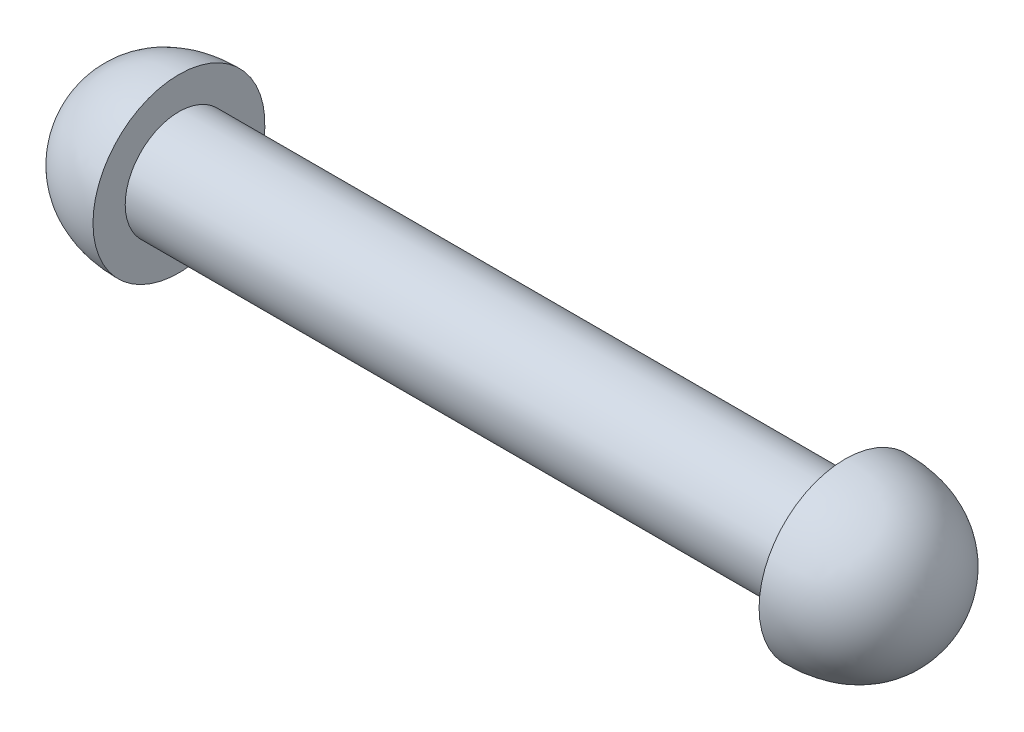
ISO-10303-21;
HEADER;
FILE_DESCRIPTION(('STEP AP214'),'2;1');
FILE_NAME('part.step','',(''),(''),'','','');
FILE_SCHEMA(('AUTOMOTIVE_DESIGN { 1 0 10303 214 1 1 1 1 }'));
ENDSEC;
DATA;
#1=APPLICATION_CONTEXT('core data for automotive mechanical design processes');
#2=APPLICATION_PROTOCOL_DEFINITION('international standard','automotive_design',2000,#1);
#3=PRODUCT_CONTEXT('',#1,'mechanical');
#4=PRODUCT('Part','Part','',(#3));
#5=PRODUCT_RELATED_PRODUCT_CATEGORY('part','',(#4));
#6=PRODUCT_DEFINITION_FORMATION('','',#4);
#7=PRODUCT_DEFINITION_CONTEXT('part definition',#1,'design');
#8=PRODUCT_DEFINITION('design','',#6,#7);
#9=PRODUCT_DEFINITION_SHAPE('','',#8);
#10=(LENGTH_UNIT() NAMED_UNIT(*) SI_UNIT(.MILLI.,.METRE.));
#11=(NAMED_UNIT(*) PLANE_ANGLE_UNIT() SI_UNIT($,.RADIAN.));
#12=(NAMED_UNIT(*) SI_UNIT($,.STERADIAN.) SOLID_ANGLE_UNIT());
#13=UNCERTAINTY_MEASURE_WITH_UNIT(LENGTH_MEASURE(1.E-05),#10,'distance_accuracy_value','');
#14=(GEOMETRIC_REPRESENTATION_CONTEXT(3) GLOBAL_UNCERTAINTY_ASSIGNED_CONTEXT((#13)) GLOBAL_UNIT_ASSIGNED_CONTEXT((#10,
#11,#12)) REPRESENTATION_CONTEXT('',''));
#15=CARTESIAN_POINT('',(0.,0.,0.));
#16=DIRECTION('',(0.,0.,1.));
#17=DIRECTION('',(1.,0.,0.));
#18=AXIS2_PLACEMENT_3D('',#15,#16,#17);
#19=CARTESIAN_POINT('',(155.,0.,0.));
#20=DIRECTION('',(-1.,0.,0.));
#21=DIRECTION('',(0.,0.,1.));
#22=AXIS2_PLACEMENT_3D('',#19,#20,#21);
#23=CYLINDRICAL_SURFACE('',#22,25.);
#24=CARTESIAN_POINT('',(0.,0.,0.));
#25=DIRECTION('',(-1.,0.,0.));
#26=DIRECTION('',(0.,0.,1.));
#27=AXIS2_PLACEMENT_3D('',#24,#25,#26);
#28=CIRCLE('',#27,25.);
#29=CARTESIAN_POINT('',(0.,0.,25.));
#30=VERTEX_POINT('',#29);
#31=EDGE_CURVE('E11',#30,#30,#28,.T.);
#32=ORIENTED_EDGE('',*,*,#31,.F.);
#33=EDGE_LOOP('',(#32));
#34=FACE_BOUND('',#33,.T.);
#35=CARTESIAN_POINT('',(310.,0.,0.));
#36=DIRECTION('',(1.,0.,0.));
#37=DIRECTION('',(0.,0.,-1.));
#38=AXIS2_PLACEMENT_3D('',#35,#36,#37);
#39=CIRCLE('',#38,25.);
#40=CARTESIAN_POINT('',(310.,0.,-25.));
#41=VERTEX_POINT('',#40);
#42=EDGE_CURVE('E64',#41,#41,#39,.T.);
#43=ORIENTED_EDGE('',*,*,#42,.F.);
#44=EDGE_LOOP('',(#43));
#45=FACE_BOUND('',#44,.T.);
#46=ADVANCED_FACE('F39',(#34,#45),#23,.T.);
#47=CARTESIAN_POINT('',(0.,40.,0.));
#48=CARTESIAN_POINT('',(-30.9912388312532,40.,0.));
#49=CARTESIAN_POINT('',(-45.4583925127281,20.1837818553006,0.));
#50=CARTESIAN_POINT('',(-45.4583925127281,0.,0.));
#51=B_SPLINE_CURVE_WITH_KNOTS('',3,(#47,#48,#49,#50),.UNSPECIFIED.,.F.,.F.,(4,4),(0.,1.),.UNSPECIFIED.);
#52=CARTESIAN_POINT('',(-100.078673333577,0.,0.));
#53=DIRECTION('',(-1.,0.,0.));
#54=AXIS1_PLACEMENT('',#52,#53);
#55=SURFACE_OF_REVOLUTION('',#51,#54);
#56=CARTESIAN_POINT('',(-45.4583925127281,0.,0.));
#57=VERTEX_POINT('',#56);
#58=VERTEX_LOOP('',#57);
#59=FACE_BOUND('',#58,.T.);
#60=CARTESIAN_POINT('',(0.,0.,0.));
#61=DIRECTION('',(-1.,0.,0.));
#62=DIRECTION('',(0.,0.,1.));
#63=AXIS2_PLACEMENT_3D('',#60,#61,#62);
#64=CIRCLE('',#63,40.);
#65=CARTESIAN_POINT('',(0.,0.,40.));
#66=VERTEX_POINT('',#65);
#67=EDGE_CURVE('E47',#66,#66,#64,.T.);
#68=ORIENTED_EDGE('',*,*,#67,.T.);
#69=EDGE_LOOP('',(#68));
#70=FACE_BOUND('',#69,.T.);
#71=ADVANCED_FACE('F80',(#59,#70),#55,.T.);
#72=CARTESIAN_POINT('',(0.,40.,0.));
#73=DIRECTION('',(-1.,0.,0.));
#74=DIRECTION('',(0.,0.,1.));
#75=AXIS2_PLACEMENT_3D('',#72,#73,#74);
#76=PLANE('',#75);
#77=ORIENTED_EDGE('',*,*,#31,.T.);
#78=EDGE_LOOP('',(#77));
#79=FACE_BOUND('',#78,.T.);
#80=ORIENTED_EDGE('',*,*,#67,.F.);
#81=EDGE_LOOP('',(#80));
#82=FACE_BOUND('',#81,.T.);
#83=ADVANCED_FACE('F57',(#79,#82),#76,.F.);
#84=CARTESIAN_POINT('',(310.,40.,0.));
#85=CARTESIAN_POINT('',(340.991238831253,40.,0.));
#86=CARTESIAN_POINT('',(355.458392512728,20.1837818553006,0.));
#87=CARTESIAN_POINT('',(355.458392512728,0.,0.));
#88=B_SPLINE_CURVE_WITH_KNOTS('',3,(#84,#85,#86,#87),.UNSPECIFIED.,.F.,.F.,(4,4),(0.,1.),.UNSPECIFIED.);
#89=CARTESIAN_POINT('',(410.078673333577,0.,0.));
#90=DIRECTION('',(1.,0.,0.));
#91=AXIS1_PLACEMENT('',#89,#90);
#92=SURFACE_OF_REVOLUTION('',#88,#91);
#93=CARTESIAN_POINT('',(355.458392512728,0.,0.));
#94=VERTEX_POINT('',#93);
#95=VERTEX_LOOP('',#94);
#96=FACE_BOUND('',#95,.T.);
#97=CARTESIAN_POINT('',(310.,0.,0.));
#98=DIRECTION('',(-1.,0.,0.));
#99=DIRECTION('',(0.,0.,1.));
#100=AXIS2_PLACEMENT_3D('',#97,#98,#99);
#101=CIRCLE('',#100,40.);
#102=CARTESIAN_POINT('',(310.,0.,40.));
#103=VERTEX_POINT('',#102);
#104=EDGE_CURVE('E61',#103,#103,#101,.T.);
#105=ORIENTED_EDGE('',*,*,#104,.F.);
#106=EDGE_LOOP('',(#105));
#107=FACE_BOUND('',#106,.T.);
#108=ADVANCED_FACE('F53',(#96,#107),#92,.T.);
#109=CARTESIAN_POINT('',(310.,40.,0.));
#110=DIRECTION('',(1.,0.,0.));
#111=DIRECTION('',(0.,0.,1.));
#112=AXIS2_PLACEMENT_3D('',#109,#110,#111);
#113=PLANE('',#112);
#114=ORIENTED_EDGE('',*,*,#42,.T.);
#115=EDGE_LOOP('',(#114));
#116=FACE_BOUND('',#115,.T.);
#117=ORIENTED_EDGE('',*,*,#104,.T.);
#118=EDGE_LOOP('',(#117));
#119=FACE_BOUND('',#118,.T.);
#120=ADVANCED_FACE('F56',(#116,#119),#113,.F.);
#121=CLOSED_SHELL('',(#46,#71,#83,#108,#120));
#122=MANIFOLD_SOLID_BREP('B2',#121);
#123=ADVANCED_BREP_SHAPE_REPRESENTATION('',(#18,#122),#14);
#124=SHAPE_DEFINITION_REPRESENTATION(#9,#123);
ENDSEC;
END-ISO-10303-21;
